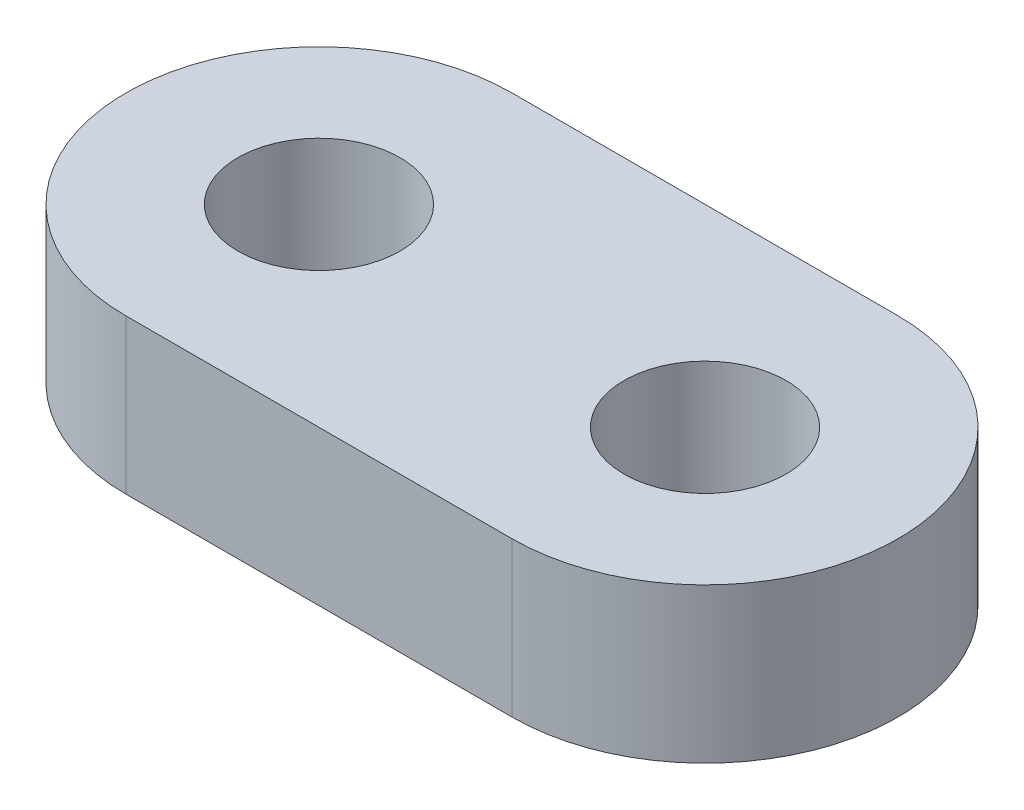
ISO-10303-21;
HEADER;
FILE_DESCRIPTION(('STEP AP214'),'2;1');
FILE_NAME('part.step','',(''),(''),'','','');
FILE_SCHEMA(('AUTOMOTIVE_DESIGN { 1 0 10303 214 1 1 1 1 }'));
ENDSEC;
DATA;
#1=APPLICATION_CONTEXT('core data for automotive mechanical design processes');
#2=APPLICATION_PROTOCOL_DEFINITION('international standard','automotive_design',2000,#1);
#3=PRODUCT_CONTEXT('',#1,'mechanical');
#4=PRODUCT('Part','Part','',(#3));
#5=PRODUCT_RELATED_PRODUCT_CATEGORY('part','',(#4));
#6=PRODUCT_DEFINITION_FORMATION('','',#4);
#7=PRODUCT_DEFINITION_CONTEXT('part definition',#1,'design');
#8=PRODUCT_DEFINITION('design','',#6,#7);
#9=PRODUCT_DEFINITION_SHAPE('','',#8);
#10=(LENGTH_UNIT() NAMED_UNIT(*) SI_UNIT(.MILLI.,.METRE.));
#11=(NAMED_UNIT(*) PLANE_ANGLE_UNIT() SI_UNIT($,.RADIAN.));
#12=(NAMED_UNIT(*) SI_UNIT($,.STERADIAN.) SOLID_ANGLE_UNIT());
#13=UNCERTAINTY_MEASURE_WITH_UNIT(LENGTH_MEASURE(1.E-05),#10,'distance_accuracy_value','');
#14=(GEOMETRIC_REPRESENTATION_CONTEXT(3) GLOBAL_UNCERTAINTY_ASSIGNED_CONTEXT((#13)) GLOBAL_UNIT_ASSIGNED_CONTEXT((#10,
#11,#12)) REPRESENTATION_CONTEXT('',''));
#15=CARTESIAN_POINT('',(0.,0.,0.));
#16=DIRECTION('',(0.,0.,1.));
#17=DIRECTION('',(1.,0.,0.));
#18=AXIS2_PLACEMENT_3D('',#15,#16,#17);
#19=CARTESIAN_POINT('',(0.,2.,0.));
#20=DIRECTION('',(0.,1.,0.));
#21=DIRECTION('',(0.,0.,1.));
#22=AXIS2_PLACEMENT_3D('',#19,#20,#21);
#23=PLANE('',#22);
#24=CARTESIAN_POINT('',(0.,2.,0.));
#25=DIRECTION('',(0.,1.,0.));
#26=DIRECTION('',(0.,0.,1.));
#27=AXIS2_PLACEMENT_3D('',#24,#25,#26);
#28=CIRCLE('',#27,1.05);
#29=CARTESIAN_POINT('',(0.,2.,1.05));
#30=VERTEX_POINT('',#29);
#31=EDGE_CURVE('E116',#30,#30,#28,.T.);
#32=ORIENTED_EDGE('',*,*,#31,.F.);
#33=EDGE_LOOP('',(#32));
#34=FACE_BOUND('',#33,.T.);
#35=CARTESIAN_POINT('',(0.,2.,0.));
#36=DIRECTION('',(0.,1.,0.));
#37=DIRECTION('',(0.,0.,1.));
#38=AXIS2_PLACEMENT_3D('',#35,#36,#37);
#39=CIRCLE('',#38,2.5);
#40=CARTESIAN_POINT('',(0.,2.,-2.5));
#41=VERTEX_POINT('',#40);
#42=CARTESIAN_POINT('',(0.,2.,2.5));
#43=VERTEX_POINT('',#42);
#44=EDGE_CURVE('E96',#41,#43,#39,.T.);
#45=ORIENTED_EDGE('',*,*,#44,.T.);
#46=DIRECTION('',(1.,0.,0.));
#47=VECTOR('',#46,1.);
#48=CARTESIAN_POINT('',(0.,2.,2.5));
#49=LINE('',#48,#47);
#50=CARTESIAN_POINT('',(5.,2.,2.5));
#51=VERTEX_POINT('',#50);
#52=EDGE_CURVE('E91',#43,#51,#49,.T.);
#53=ORIENTED_EDGE('',*,*,#52,.T.);
#54=CARTESIAN_POINT('',(5.,2.,0.));
#55=DIRECTION('',(0.,1.,0.));
#56=DIRECTION('',(0.,0.,1.));
#57=AXIS2_PLACEMENT_3D('',#54,#55,#56);
#58=CIRCLE('',#57,2.5);
#59=CARTESIAN_POINT('',(5.,2.,-2.5));
#60=VERTEX_POINT('',#59);
#61=EDGE_CURVE('E94',#51,#60,#58,.T.);
#62=ORIENTED_EDGE('',*,*,#61,.T.);
#63=DIRECTION('',(-1.,0.,0.));
#64=VECTOR('',#63,1.);
#65=CARTESIAN_POINT('',(0.,2.,-2.5));
#66=LINE('',#65,#64);
#67=EDGE_CURVE('E61',#60,#41,#66,.T.);
#68=ORIENTED_EDGE('',*,*,#67,.T.);
#69=EDGE_LOOP('',(#45,#53,#62,#68));
#70=FACE_BOUND('',#69,.T.);
#71=CARTESIAN_POINT('',(5.,2.,0.));
#72=DIRECTION('',(0.,1.,0.));
#73=DIRECTION('',(0.,0.,1.));
#74=AXIS2_PLACEMENT_3D('',#71,#72,#73);
#75=CIRCLE('',#74,1.04999999999999);
#76=CARTESIAN_POINT('',(5.,2.,1.04999999999999));
#77=VERTEX_POINT('',#76);
#78=EDGE_CURVE('E138',#77,#77,#75,.T.);
#79=ORIENTED_EDGE('',*,*,#78,.F.);
#80=EDGE_LOOP('',(#79));
#81=FACE_BOUND('',#80,.T.);
#82=ADVANCED_FACE('F43',(#34,#70,#81),#23,.T.);
#83=CARTESIAN_POINT('',(0.,0.,0.));
#84=DIRECTION('',(0.,1.,0.));
#85=DIRECTION('',(0.,0.,1.));
#86=AXIS2_PLACEMENT_3D('',#83,#84,#85);
#87=PLANE('',#86);
#88=CARTESIAN_POINT('',(0.,0.,0.));
#89=DIRECTION('',(0.,1.,0.));
#90=DIRECTION('',(0.,0.,1.));
#91=AXIS2_PLACEMENT_3D('',#88,#89,#90);
#92=CIRCLE('',#91,2.5);
#93=CARTESIAN_POINT('',(0.,0.,-2.5));
#94=VERTEX_POINT('',#93);
#95=CARTESIAN_POINT('',(0.,0.,2.5));
#96=VERTEX_POINT('',#95);
#97=EDGE_CURVE('E112',#94,#96,#92,.T.);
#98=ORIENTED_EDGE('',*,*,#97,.F.);
#99=DIRECTION('',(-1.,0.,0.));
#100=VECTOR('',#99,1.);
#101=CARTESIAN_POINT('',(0.,0.,-2.5));
#102=LINE('',#101,#100);
#103=CARTESIAN_POINT('',(5.,0.,-2.5));
#104=VERTEX_POINT('',#103);
#105=EDGE_CURVE('E84',#104,#94,#102,.T.);
#106=ORIENTED_EDGE('',*,*,#105,.F.);
#107=CARTESIAN_POINT('',(5.,0.,0.));
#108=DIRECTION('',(0.,1.,0.));
#109=DIRECTION('',(0.,0.,1.));
#110=AXIS2_PLACEMENT_3D('',#107,#108,#109);
#111=CIRCLE('',#110,2.5);
#112=CARTESIAN_POINT('',(5.,0.,2.5));
#113=VERTEX_POINT('',#112);
#114=EDGE_CURVE('E78',#113,#104,#111,.T.);
#115=ORIENTED_EDGE('',*,*,#114,.F.);
#116=DIRECTION('',(1.,0.,0.));
#117=VECTOR('',#116,1.);
#118=CARTESIAN_POINT('',(0.,0.,2.5));
#119=LINE('',#118,#117);
#120=EDGE_CURVE('E101',#96,#113,#119,.T.);
#121=ORIENTED_EDGE('',*,*,#120,.F.);
#122=EDGE_LOOP('',(#98,#106,#115,#121));
#123=FACE_BOUND('',#122,.T.);
#124=CARTESIAN_POINT('',(0.,0.,0.));
#125=DIRECTION('',(0.,1.,0.));
#126=DIRECTION('',(0.,0.,1.));
#127=AXIS2_PLACEMENT_3D('',#124,#125,#126);
#128=CIRCLE('',#127,1.05);
#129=CARTESIAN_POINT('',(0.,0.,1.05));
#130=VERTEX_POINT('',#129);
#131=EDGE_CURVE('E134',#130,#130,#128,.T.);
#132=ORIENTED_EDGE('',*,*,#131,.T.);
#133=EDGE_LOOP('',(#132));
#134=FACE_BOUND('',#133,.T.);
#135=CARTESIAN_POINT('',(5.,0.,0.));
#136=DIRECTION('',(0.,1.,0.));
#137=DIRECTION('',(0.,0.,1.));
#138=AXIS2_PLACEMENT_3D('',#135,#136,#137);
#139=CIRCLE('',#138,1.04999999999999);
#140=CARTESIAN_POINT('',(5.,0.,1.04999999999999));
#141=VERTEX_POINT('',#140);
#142=EDGE_CURVE('E142',#141,#141,#139,.T.);
#143=ORIENTED_EDGE('',*,*,#142,.T.);
#144=EDGE_LOOP('',(#143));
#145=FACE_BOUND('',#144,.T.);
#146=ADVANCED_FACE('F129',(#123,#134,#145),#87,.F.);
#147=CARTESIAN_POINT('',(0.,2.,0.));
#148=DIRECTION('',(0.,-1.,0.));
#149=DIRECTION('',(0.,0.,-1.));
#150=AXIS2_PLACEMENT_3D('',#147,#148,#149);
#151=CYLINDRICAL_SURFACE('',#150,2.5);
#152=ORIENTED_EDGE('',*,*,#97,.T.);
#153=DIRECTION('',(0.,-1.,0.));
#154=VECTOR('',#153,1.);
#155=CARTESIAN_POINT('',(0.,2.,2.5));
#156=LINE('',#155,#154);
#157=EDGE_CURVE('E11',#43,#96,#156,.T.);
#158=ORIENTED_EDGE('',*,*,#157,.F.);
#159=ORIENTED_EDGE('',*,*,#44,.F.);
#160=DIRECTION('',(0.,-1.,0.));
#161=VECTOR('',#160,1.);
#162=CARTESIAN_POINT('',(0.,2.,-2.5));
#163=LINE('',#162,#161);
#164=EDGE_CURVE('E108',#41,#94,#163,.T.);
#165=ORIENTED_EDGE('',*,*,#164,.T.);
#166=EDGE_LOOP('',(#152,#158,#159,#165));
#167=FACE_BOUND('',#166,.T.);
#168=ADVANCED_FACE('F45',(#167),#151,.T.);
#169=CARTESIAN_POINT('',(0.,2.,2.5));
#170=DIRECTION('',(0.,0.,-1.));
#171=DIRECTION('',(-1.,0.,0.));
#172=AXIS2_PLACEMENT_3D('',#169,#170,#171);
#173=PLANE('',#172);
#174=ORIENTED_EDGE('',*,*,#120,.T.);
#175=DIRECTION('',(0.,-1.,0.));
#176=VECTOR('',#175,1.);
#177=CARTESIAN_POINT('',(5.,2.,2.5));
#178=LINE('',#177,#176);
#179=EDGE_CURVE('E53',#51,#113,#178,.T.);
#180=ORIENTED_EDGE('',*,*,#179,.F.);
#181=ORIENTED_EDGE('',*,*,#52,.F.);
#182=ORIENTED_EDGE('',*,*,#157,.T.);
#183=EDGE_LOOP('',(#174,#180,#181,#182));
#184=FACE_BOUND('',#183,.T.);
#185=ADVANCED_FACE('F100',(#184),#173,.F.);
#186=CARTESIAN_POINT('',(5.,2.,0.));
#187=DIRECTION('',(0.,-1.,0.));
#188=DIRECTION('',(0.,0.,-1.));
#189=AXIS2_PLACEMENT_3D('',#186,#187,#188);
#190=CYLINDRICAL_SURFACE('',#189,2.5);
#191=ORIENTED_EDGE('',*,*,#114,.T.);
#192=DIRECTION('',(0.,-1.,0.));
#193=VECTOR('',#192,1.);
#194=CARTESIAN_POINT('',(5.,2.,-2.5));
#195=LINE('',#194,#193);
#196=EDGE_CURVE('E103',#60,#104,#195,.T.);
#197=ORIENTED_EDGE('',*,*,#196,.F.);
#198=ORIENTED_EDGE('',*,*,#61,.F.);
#199=ORIENTED_EDGE('',*,*,#179,.T.);
#200=EDGE_LOOP('',(#191,#197,#198,#199));
#201=FACE_BOUND('',#200,.T.);
#202=ADVANCED_FACE('F104',(#201),#190,.T.);
#203=CARTESIAN_POINT('',(0.,2.,-2.5));
#204=DIRECTION('',(0.,0.,1.));
#205=DIRECTION('',(1.,0.,0.));
#206=AXIS2_PLACEMENT_3D('',#203,#204,#205);
#207=PLANE('',#206);
#208=ORIENTED_EDGE('',*,*,#105,.T.);
#209=ORIENTED_EDGE('',*,*,#164,.F.);
#210=ORIENTED_EDGE('',*,*,#67,.F.);
#211=ORIENTED_EDGE('',*,*,#196,.T.);
#212=EDGE_LOOP('',(#208,#209,#210,#211));
#213=FACE_BOUND('',#212,.T.);
#214=ADVANCED_FACE('F126',(#213),#207,.F.);
#215=CARTESIAN_POINT('',(0.,2.,0.));
#216=DIRECTION('',(0.,-1.,0.));
#217=DIRECTION('',(0.,0.,-1.));
#218=AXIS2_PLACEMENT_3D('',#215,#216,#217);
#219=CYLINDRICAL_SURFACE('',#218,1.05);
#220=ORIENTED_EDGE('',*,*,#31,.T.);
#221=EDGE_LOOP('',(#220));
#222=FACE_BOUND('',#221,.T.);
#223=ORIENTED_EDGE('',*,*,#131,.F.);
#224=EDGE_LOOP('',(#223));
#225=FACE_BOUND('',#224,.T.);
#226=ADVANCED_FACE('F161',(#222,#225),#219,.F.);
#227=CARTESIAN_POINT('',(5.,2.,0.));
#228=DIRECTION('',(0.,-1.,0.));
#229=DIRECTION('',(0.,0.,-1.));
#230=AXIS2_PLACEMENT_3D('',#227,#228,#229);
#231=CYLINDRICAL_SURFACE('',#230,1.04999999999999);
#232=ORIENTED_EDGE('',*,*,#78,.T.);
#233=EDGE_LOOP('',(#232));
#234=FACE_BOUND('',#233,.T.);
#235=ORIENTED_EDGE('',*,*,#142,.F.);
#236=EDGE_LOOP('',(#235));
#237=FACE_BOUND('',#236,.T.);
#238=ADVANCED_FACE('F150',(#234,#237),#231,.F.);
#239=CLOSED_SHELL('',(#82,#146,#168,#185,#202,#214,#226,#238));
#240=MANIFOLD_SOLID_BREP('B2',#239);
#241=ADVANCED_BREP_SHAPE_REPRESENTATION('',(#18,#240),#14);
#242=SHAPE_DEFINITION_REPRESENTATION(#9,#241);
ENDSEC;
END-ISO-10303-21;
